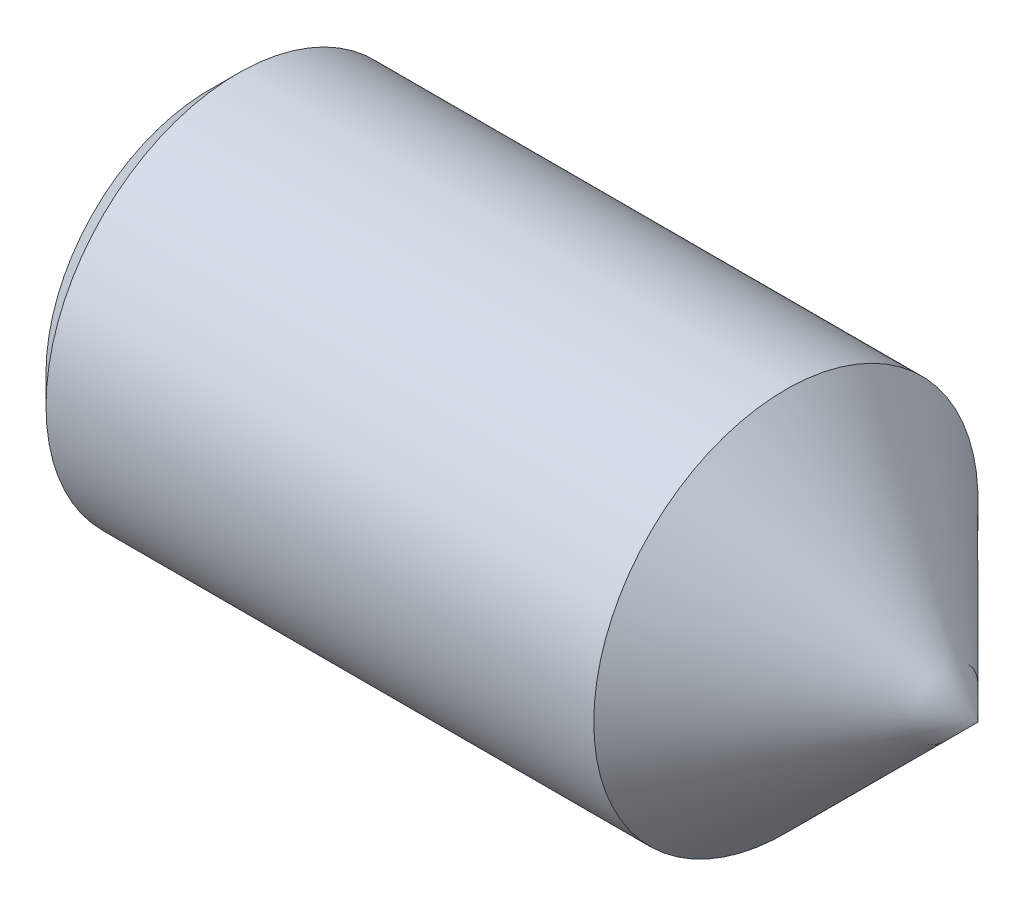
ISO-10303-21;
HEADER;
FILE_DESCRIPTION(('STEP AP214'),'2;1');
FILE_NAME('part.step','',(''),(''),'','','');
FILE_SCHEMA(('AUTOMOTIVE_DESIGN { 1 0 10303 214 1 1 1 1 }'));
ENDSEC;
DATA;
#1=APPLICATION_CONTEXT('core data for automotive mechanical design processes');
#2=APPLICATION_PROTOCOL_DEFINITION('international standard','automotive_design',2000,#1);
#3=PRODUCT_CONTEXT('',#1,'mechanical');
#4=PRODUCT('Part','Part','',(#3));
#5=PRODUCT_RELATED_PRODUCT_CATEGORY('part','',(#4));
#6=PRODUCT_DEFINITION_FORMATION('','',#4);
#7=PRODUCT_DEFINITION_CONTEXT('part definition',#1,'design');
#8=PRODUCT_DEFINITION('design','',#6,#7);
#9=PRODUCT_DEFINITION_SHAPE('','',#8);
#10=(LENGTH_UNIT() NAMED_UNIT(*) SI_UNIT(.MILLI.,.METRE.));
#11=(NAMED_UNIT(*) PLANE_ANGLE_UNIT() SI_UNIT($,.RADIAN.));
#12=(NAMED_UNIT(*) SI_UNIT($,.STERADIAN.) SOLID_ANGLE_UNIT());
#13=UNCERTAINTY_MEASURE_WITH_UNIT(LENGTH_MEASURE(1.E-05),#10,'distance_accuracy_value','');
#14=(GEOMETRIC_REPRESENTATION_CONTEXT(3) GLOBAL_UNCERTAINTY_ASSIGNED_CONTEXT((#13)) GLOBAL_UNIT_ASSIGNED_CONTEXT((#10,
#11,#12)) REPRESENTATION_CONTEXT('',''));
#15=CARTESIAN_POINT('',(0.,0.,0.));
#16=DIRECTION('',(0.,0.,1.));
#17=DIRECTION('',(1.,0.,0.));
#18=AXIS2_PLACEMENT_3D('',#15,#16,#17);
#19=CARTESIAN_POINT('',(0.,0.,0.));
#20=DIRECTION('',(-1.,0.,0.));
#21=DIRECTION('',(0.,0.,1.));
#22=AXIS2_PLACEMENT_3D('',#19,#20,#21);
#23=PLANE('',#22);
#24=CARTESIAN_POINT('',(0.,0.,0.));
#25=DIRECTION('',(-1.,0.,0.));
#26=DIRECTION('',(0.,0.,1.));
#27=AXIS2_PLACEMENT_3D('',#24,#25,#26);
#28=CIRCLE('',#27,10.81024);
#29=CARTESIAN_POINT('',(0.,0.,10.81024));
#30=VERTEX_POINT('',#29);
#31=EDGE_CURVE('E11',#30,#30,#28,.T.);
#32=ORIENTED_EDGE('',*,*,#31,.T.);
#33=EDGE_LOOP('',(#32));
#34=FACE_BOUND('',#33,.T.);
#35=DIRECTION('',(0.,0.,-1.));
#36=VECTOR('',#35,1.);
#37=CARTESIAN_POINT('',(0.,7.1374,4.12077981131403));
#38=LINE('',#37,#36);
#39=CARTESIAN_POINT('',(0.,7.1374,4.12077981131403));
#40=VERTEX_POINT('',#39);
#41=CARTESIAN_POINT('',(0.,7.1374,-4.12077981131404));
#42=VERTEX_POINT('',#41);
#43=EDGE_CURVE('E93',#40,#42,#38,.T.);
#44=ORIENTED_EDGE('',*,*,#43,.F.);
#45=DIRECTION('',(0.,-0.866025403784439,0.5));
#46=VECTOR('',#45,1.);
#47=CARTESIAN_POINT('',(0.,7.1374,4.12077981131403));
#48=LINE('',#47,#46);
#49=CARTESIAN_POINT('',(0.,0.,8.24155962262807));
#50=VERTEX_POINT('',#49);
#51=EDGE_CURVE('E46',#40,#50,#48,.T.);
#52=ORIENTED_EDGE('',*,*,#51,.T.);
#53=DIRECTION('',(0.,0.866025403784439,0.5));
#54=VECTOR('',#53,1.);
#55=CARTESIAN_POINT('',(0.,-7.13739999999999,4.12077981131404));
#56=LINE('',#55,#54);
#57=CARTESIAN_POINT('',(0.,-7.13739999999999,4.12077981131404));
#58=VERTEX_POINT('',#57);
#59=EDGE_CURVE('E99',#58,#50,#56,.T.);
#60=ORIENTED_EDGE('',*,*,#59,.F.);
#61=DIRECTION('',(0.,0.,-1.));
#62=VECTOR('',#61,1.);
#63=CARTESIAN_POINT('',(0.,-7.13739999999999,4.12077981131404));
#64=LINE('',#63,#62);
#65=CARTESIAN_POINT('',(0.,-7.13739999999999,-4.12077981131403));
#66=VERTEX_POINT('',#65);
#67=EDGE_CURVE('E119',#58,#66,#64,.T.);
#68=ORIENTED_EDGE('',*,*,#67,.T.);
#69=DIRECTION('',(0.,0.866025403784438,-0.500000000000001));
#70=VECTOR('',#69,1.);
#71=CARTESIAN_POINT('',(0.,-7.13739999999999,-4.12077981131403));
#72=LINE('',#71,#70);
#73=CARTESIAN_POINT('',(0.,0.,-8.24155962262807));
#74=VERTEX_POINT('',#73);
#75=EDGE_CURVE('E122',#66,#74,#72,.T.);
#76=ORIENTED_EDGE('',*,*,#75,.T.);
#77=DIRECTION('',(0.,-0.866025403784439,-0.5));
#78=VECTOR('',#77,1.);
#79=CARTESIAN_POINT('',(0.,7.1374,-4.12077981131404));
#80=LINE('',#79,#78);
#81=EDGE_CURVE('E125',#42,#74,#80,.T.);
#82=ORIENTED_EDGE('',*,*,#81,.F.);
#83=EDGE_LOOP('',(#44,#52,#60,#68,#76,#82));
#84=FACE_BOUND('',#83,.T.);
#85=ADVANCED_FACE('F32',(#34,#84),#23,.T.);
#86=CARTESIAN_POINT('',(0.,0.,0.));
#87=DIRECTION('',(1.,0.,0.));
#88=DIRECTION('',(0.,0.,-1.));
#89=AXIS2_PLACEMENT_3D('',#86,#87,#88);
#90=CONICAL_SURFACE('',#89,10.81024,0.785398163397449);
#91=CARTESIAN_POINT('',(1.88976,0.,0.));
#92=DIRECTION('',(-1.,0.,0.));
#93=DIRECTION('',(0.,0.,1.));
#94=AXIS2_PLACEMENT_3D('',#91,#92,#93);
#95=CIRCLE('',#94,12.7);
#96=CARTESIAN_POINT('',(1.88976,0.,12.7));
#97=VERTEX_POINT('',#96);
#98=EDGE_CURVE('E39',#97,#97,#95,.T.);
#99=ORIENTED_EDGE('',*,*,#98,.T.);
#100=EDGE_LOOP('',(#99));
#101=FACE_BOUND('',#100,.T.);
#102=ORIENTED_EDGE('',*,*,#31,.F.);
#103=EDGE_LOOP('',(#102));
#104=FACE_BOUND('',#103,.T.);
#105=ADVANCED_FACE('F142',(#101,#104),#90,.T.);
#106=CARTESIAN_POINT('',(-12.7,0.,0.));
#107=DIRECTION('',(-1.,0.,0.));
#108=DIRECTION('',(0.,0.,1.));
#109=AXIS2_PLACEMENT_3D('',#106,#107,#108);
#110=CYLINDRICAL_SURFACE('',#109,12.7);
#111=CARTESIAN_POINT('',(38.1,0.,0.));
#112=DIRECTION('',(-1.,0.,0.));
#113=DIRECTION('',(0.,0.,1.));
#114=AXIS2_PLACEMENT_3D('',#111,#112,#113);
#115=CIRCLE('',#114,12.7);
#116=CARTESIAN_POINT('',(38.1,0.,12.7));
#117=VERTEX_POINT('',#116);
#118=EDGE_CURVE('E100',#117,#117,#115,.T.);
#119=ORIENTED_EDGE('',*,*,#118,.T.);
#120=EDGE_LOOP('',(#119));
#121=FACE_BOUND('',#120,.T.);
#122=ORIENTED_EDGE('',*,*,#98,.F.);
#123=EDGE_LOOP('',(#122));
#124=FACE_BOUND('',#123,.T.);
#125=ADVANCED_FACE('F145',(#121,#124),#110,.T.);
#126=CARTESIAN_POINT('',(38.1,0.,0.));
#127=DIRECTION('',(-1.,0.,0.));
#128=DIRECTION('',(0.,0.,1.));
#129=AXIS2_PLACEMENT_3D('',#126,#127,#128);
#130=CONICAL_SURFACE('',#129,12.7,0.785398163397448);
#131=CARTESIAN_POINT('',(50.8,0.,0.));
#132=VERTEX_POINT('',#131);
#133=VERTEX_LOOP('',#132);
#134=FACE_BOUND('',#133,.T.);
#135=ORIENTED_EDGE('',*,*,#118,.F.);
#136=EDGE_LOOP('',(#135));
#137=FACE_BOUND('',#136,.T.);
#138=ADVANCED_FACE('F147',(#134,#137),#130,.T.);
#139=CARTESIAN_POINT('',(14.2748,7.1374,4.12077981131403));
#140=DIRECTION('',(0.,-0.5,-0.866025403784438));
#141=DIRECTION('',(0.,0.866025403784439,-0.5));
#142=AXIS2_PLACEMENT_3D('',#139,#140,#141);
#143=PLANE('',#142);
#144=ORIENTED_EDGE('',*,*,#51,.F.);
#145=DIRECTION('',(-1.,0.,0.));
#146=VECTOR('',#145,1.);
#147=CARTESIAN_POINT('',(14.2748,7.1374,4.12077981131403));
#148=LINE('',#147,#146);
#149=CARTESIAN_POINT('',(14.2748,7.1374,4.12077981131403));
#150=VERTEX_POINT('',#149);
#151=EDGE_CURVE('E87',#150,#40,#148,.T.);
#152=ORIENTED_EDGE('',*,*,#151,.F.);
#153=DIRECTION('',(0.,-0.866025403784439,0.5));
#154=VECTOR('',#153,1.);
#155=CARTESIAN_POINT('',(14.2748,7.1374,4.12077981131403));
#156=LINE('',#155,#154);
#157=CARTESIAN_POINT('',(14.2748,0.,8.24155962262807));
#158=VERTEX_POINT('',#157);
#159=EDGE_CURVE('E82',#150,#158,#156,.T.);
#160=ORIENTED_EDGE('',*,*,#159,.T.);
#161=DIRECTION('',(-1.,0.,0.));
#162=VECTOR('',#161,1.);
#163=CARTESIAN_POINT('',(14.2748,0.,8.24155962262807));
#164=LINE('',#163,#162);
#165=EDGE_CURVE('E85',#158,#50,#164,.T.);
#166=ORIENTED_EDGE('',*,*,#165,.T.);
#167=EDGE_LOOP('',(#144,#152,#160,#166));
#168=FACE_BOUND('',#167,.T.);
#169=ADVANCED_FACE('F84',(#168),#143,.T.);
#170=CARTESIAN_POINT('',(14.2748,-7.13739999999999,4.12077981131404));
#171=DIRECTION('',(0.,-0.5,0.866025403784439));
#172=DIRECTION('',(0.,-0.866025403784439,-0.5));
#173=AXIS2_PLACEMENT_3D('',#170,#171,#172);
#174=PLANE('',#173);
#175=ORIENTED_EDGE('',*,*,#59,.T.);
#176=ORIENTED_EDGE('',*,*,#165,.F.);
#177=DIRECTION('',(0.,0.866025403784439,0.5));
#178=VECTOR('',#177,1.);
#179=CARTESIAN_POINT('',(14.2748,-7.13739999999999,4.12077981131404));
#180=LINE('',#179,#178);
#181=CARTESIAN_POINT('',(14.2748,-7.13739999999999,4.12077981131404));
#182=VERTEX_POINT('',#181);
#183=EDGE_CURVE('E92',#182,#158,#180,.T.);
#184=ORIENTED_EDGE('',*,*,#183,.F.);
#185=DIRECTION('',(-1.,0.,0.));
#186=VECTOR('',#185,1.);
#187=CARTESIAN_POINT('',(14.2748,-7.13739999999999,4.12077981131404));
#188=LINE('',#187,#186);
#189=EDGE_CURVE('E101',#182,#58,#188,.T.);
#190=ORIENTED_EDGE('',*,*,#189,.T.);
#191=EDGE_LOOP('',(#175,#176,#184,#190));
#192=FACE_BOUND('',#191,.T.);
#193=ADVANCED_FACE('F97',(#192),#174,.F.);
#194=CARTESIAN_POINT('',(14.2748,-7.13739999999999,4.12077981131404));
#195=DIRECTION('',(0.,1.,0.));
#196=DIRECTION('',(0.,0.,1.));
#197=AXIS2_PLACEMENT_3D('',#194,#195,#196);
#198=PLANE('',#197);
#199=ORIENTED_EDGE('',*,*,#67,.F.);
#200=ORIENTED_EDGE('',*,*,#189,.F.);
#201=DIRECTION('',(0.,0.,-1.));
#202=VECTOR('',#201,1.);
#203=CARTESIAN_POINT('',(14.2748,-7.13739999999999,4.12077981131404));
#204=LINE('',#203,#202);
#205=CARTESIAN_POINT('',(14.2748,-7.13739999999999,-4.12077981131403));
#206=VERTEX_POINT('',#205);
#207=EDGE_CURVE('E106',#182,#206,#204,.T.);
#208=ORIENTED_EDGE('',*,*,#207,.T.);
#209=DIRECTION('',(-1.,0.,0.));
#210=VECTOR('',#209,1.);
#211=CARTESIAN_POINT('',(14.2748,-7.13739999999999,-4.12077981131403));
#212=LINE('',#211,#210);
#213=EDGE_CURVE('E135',#206,#66,#212,.T.);
#214=ORIENTED_EDGE('',*,*,#213,.T.);
#215=EDGE_LOOP('',(#199,#200,#208,#214));
#216=FACE_BOUND('',#215,.T.);
#217=ADVANCED_FACE('F175',(#216),#198,.T.);
#218=CARTESIAN_POINT('',(14.2748,-7.13739999999999,-4.12077981131403));
#219=DIRECTION('',(0.,0.500000000000001,0.866025403784438));
#220=DIRECTION('',(0.,-0.866025403784438,0.500000000000001));
#221=AXIS2_PLACEMENT_3D('',#218,#219,#220);
#222=PLANE('',#221);
#223=ORIENTED_EDGE('',*,*,#75,.F.);
#224=ORIENTED_EDGE('',*,*,#213,.F.);
#225=DIRECTION('',(0.,0.866025403784438,-0.500000000000001));
#226=VECTOR('',#225,1.);
#227=CARTESIAN_POINT('',(14.2748,-7.13739999999999,-4.12077981131403));
#228=LINE('',#227,#226);
#229=CARTESIAN_POINT('',(14.2748,0.,-8.24155962262807));
#230=VERTEX_POINT('',#229);
#231=EDGE_CURVE('E108',#206,#230,#228,.T.);
#232=ORIENTED_EDGE('',*,*,#231,.T.);
#233=DIRECTION('',(-1.,0.,0.));
#234=VECTOR('',#233,1.);
#235=CARTESIAN_POINT('',(14.2748,0.,-8.24155962262807));
#236=LINE('',#235,#234);
#237=EDGE_CURVE('E133',#230,#74,#236,.T.);
#238=ORIENTED_EDGE('',*,*,#237,.T.);
#239=EDGE_LOOP('',(#223,#224,#232,#238));
#240=FACE_BOUND('',#239,.T.);
#241=ADVANCED_FACE('F171',(#240),#222,.T.);
#242=CARTESIAN_POINT('',(14.2748,7.1374,-4.12077981131404));
#243=DIRECTION('',(0.,0.5,-0.866025403784439));
#244=DIRECTION('',(0.,0.866025403784439,0.5));
#245=AXIS2_PLACEMENT_3D('',#242,#243,#244);
#246=PLANE('',#245);
#247=ORIENTED_EDGE('',*,*,#81,.T.);
#248=ORIENTED_EDGE('',*,*,#237,.F.);
#249=DIRECTION('',(0.,-0.866025403784439,-0.5));
#250=VECTOR('',#249,1.);
#251=CARTESIAN_POINT('',(14.2748,7.1374,-4.12077981131404));
#252=LINE('',#251,#250);
#253=CARTESIAN_POINT('',(14.2748,7.1374,-4.12077981131404));
#254=VERTEX_POINT('',#253);
#255=EDGE_CURVE('E112',#254,#230,#252,.T.);
#256=ORIENTED_EDGE('',*,*,#255,.F.);
#257=DIRECTION('',(-1.,0.,0.));
#258=VECTOR('',#257,1.);
#259=CARTESIAN_POINT('',(14.2748,7.1374,-4.12077981131404));
#260=LINE('',#259,#258);
#261=EDGE_CURVE('E131',#254,#42,#260,.T.);
#262=ORIENTED_EDGE('',*,*,#261,.T.);
#263=EDGE_LOOP('',(#247,#248,#256,#262));
#264=FACE_BOUND('',#263,.T.);
#265=ADVANCED_FACE('F168',(#264),#246,.F.);
#266=CARTESIAN_POINT('',(14.2748,7.1374,4.12077981131403));
#267=DIRECTION('',(0.,1.,0.));
#268=DIRECTION('',(0.,0.,1.));
#269=AXIS2_PLACEMENT_3D('',#266,#267,#268);
#270=PLANE('',#269);
#271=ORIENTED_EDGE('',*,*,#43,.T.);
#272=ORIENTED_EDGE('',*,*,#261,.F.);
#273=DIRECTION('',(0.,0.,-1.));
#274=VECTOR('',#273,1.);
#275=CARTESIAN_POINT('',(14.2748,7.1374,4.12077981131403));
#276=LINE('',#275,#274);
#277=EDGE_CURVE('E115',#150,#254,#276,.T.);
#278=ORIENTED_EDGE('',*,*,#277,.F.);
#279=ORIENTED_EDGE('',*,*,#151,.T.);
#280=EDGE_LOOP('',(#271,#272,#278,#279));
#281=FACE_BOUND('',#280,.T.);
#282=ADVANCED_FACE('F164',(#281),#270,.F.);
#283=CARTESIAN_POINT('',(14.2748,14.2748,0.));
#284=DIRECTION('',(1.,0.,0.));
#285=DIRECTION('',(0.,0.,-1.));
#286=AXIS2_PLACEMENT_3D('',#283,#284,#285);
#287=PLANE('',#286);
#288=ORIENTED_EDGE('',*,*,#159,.F.);
#289=ORIENTED_EDGE('',*,*,#277,.T.);
#290=ORIENTED_EDGE('',*,*,#255,.T.);
#291=ORIENTED_EDGE('',*,*,#231,.F.);
#292=ORIENTED_EDGE('',*,*,#207,.F.);
#293=ORIENTED_EDGE('',*,*,#183,.T.);
#294=EDGE_LOOP('',(#288,#289,#290,#291,#292,#293));
#295=FACE_BOUND('',#294,.T.);
#296=ADVANCED_FACE('F104',(#295),#287,.F.);
#297=CLOSED_SHELL('',(#85,#105,#125,#138,#169,#193,#217,#241,#265,#282,#296));
#298=MANIFOLD_SOLID_BREP('B2',#297);
#299=ADVANCED_BREP_SHAPE_REPRESENTATION('',(#18,#298),#14);
#300=SHAPE_DEFINITION_REPRESENTATION(#9,#299);
ENDSEC;
END-ISO-10303-21;
